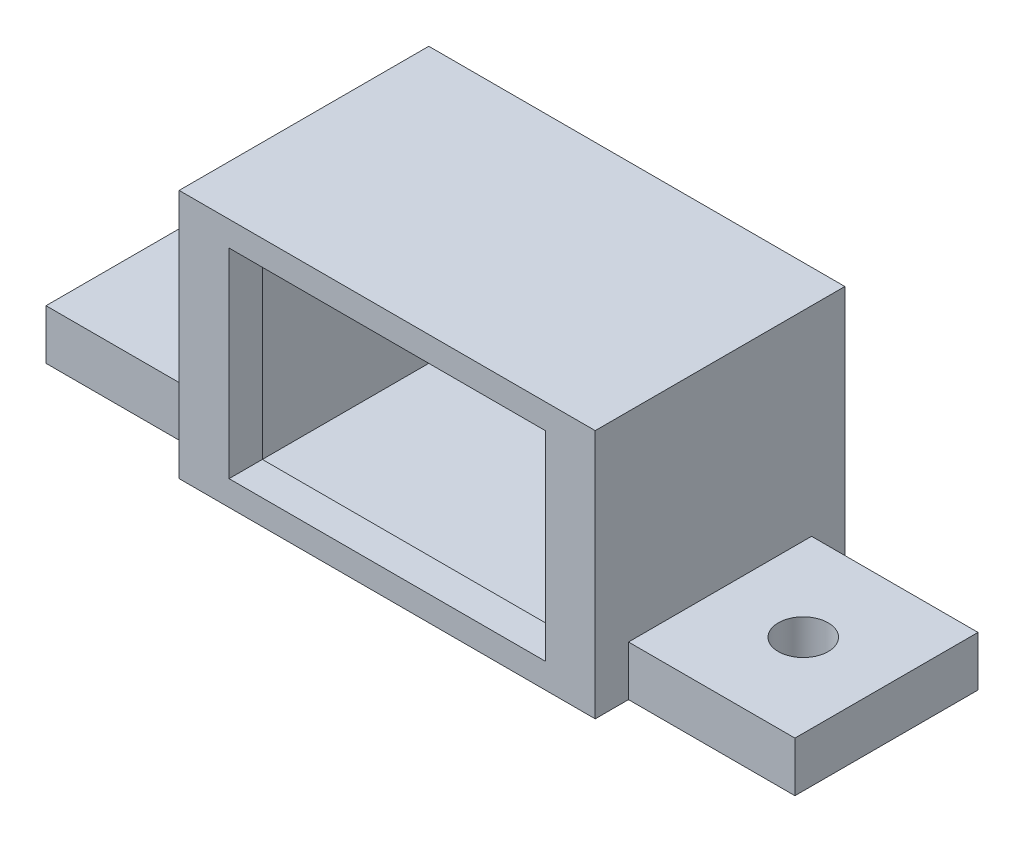
ISO-10303-21;
HEADER;
FILE_DESCRIPTION(('STEP AP214'),'2;1');
FILE_NAME('part.step','',(''),(''),'','','');
FILE_SCHEMA(('AUTOMOTIVE_DESIGN { 1 0 10303 214 1 1 1 1 }'));
ENDSEC;
DATA;
#1=APPLICATION_CONTEXT('core data for automotive mechanical design processes');
#2=APPLICATION_PROTOCOL_DEFINITION('international standard','automotive_design',2000,#1);
#3=PRODUCT_CONTEXT('',#1,'mechanical');
#4=PRODUCT('Part','Part','',(#3));
#5=PRODUCT_RELATED_PRODUCT_CATEGORY('part','',(#4));
#6=PRODUCT_DEFINITION_FORMATION('','',#4);
#7=PRODUCT_DEFINITION_CONTEXT('part definition',#1,'design');
#8=PRODUCT_DEFINITION('design','',#6,#7);
#9=PRODUCT_DEFINITION_SHAPE('','',#8);
#10=(LENGTH_UNIT() NAMED_UNIT(*) SI_UNIT(.MILLI.,.METRE.));
#11=(NAMED_UNIT(*) PLANE_ANGLE_UNIT() SI_UNIT($,.RADIAN.));
#12=(NAMED_UNIT(*) SI_UNIT($,.STERADIAN.) SOLID_ANGLE_UNIT());
#13=UNCERTAINTY_MEASURE_WITH_UNIT(LENGTH_MEASURE(1.E-05),#10,'distance_accuracy_value','');
#14=(GEOMETRIC_REPRESENTATION_CONTEXT(3) GLOBAL_UNCERTAINTY_ASSIGNED_CONTEXT((#13)) GLOBAL_UNIT_ASSIGNED_CONTEXT((#10,
#11,#12)) REPRESENTATION_CONTEXT('',''));
#15=CARTESIAN_POINT('',(0.,0.,0.));
#16=DIRECTION('',(0.,0.,1.));
#17=DIRECTION('',(1.,0.,0.));
#18=AXIS2_PLACEMENT_3D('',#15,#16,#17);
#19=CARTESIAN_POINT('',(25.,-15.,15.));
#20=DIRECTION('',(-1.,0.,0.));
#21=DIRECTION('',(0.,-1.,0.));
#22=AXIS2_PLACEMENT_3D('',#19,#20,#21);
#23=PLANE('',#22);
#24=DIRECTION('',(0.,-1.,0.));
#25=VECTOR('',#24,1.);
#26=CARTESIAN_POINT('',(25.,-15.,13.));
#27=LINE('',#26,#25);
#28=CARTESIAN_POINT('',(25.,-12.,13.));
#29=VERTEX_POINT('',#28);
#30=CARTESIAN_POINT('',(25.,-15.,13.));
#31=VERTEX_POINT('',#30);
#32=EDGE_CURVE('E61',#29,#31,#27,.T.);
#33=ORIENTED_EDGE('',*,*,#32,.F.);
#34=DIRECTION('',(0.,0.,1.));
#35=VECTOR('',#34,1.);
#36=CARTESIAN_POINT('',(25.,-12.,13.));
#37=LINE('',#36,#35);
#38=CARTESIAN_POINT('',(25.,-12.,2.));
#39=VERTEX_POINT('',#38);
#40=EDGE_CURVE('E665',#39,#29,#37,.T.);
#41=ORIENTED_EDGE('',*,*,#40,.F.);
#42=DIRECTION('',(0.,1.,0.));
#43=VECTOR('',#42,1.);
#44=CARTESIAN_POINT('',(25.,-15.,2.));
#45=LINE('',#44,#43);
#46=CARTESIAN_POINT('',(25.,-15.,2.));
#47=VERTEX_POINT('',#46);
#48=EDGE_CURVE('E67',#47,#39,#45,.T.);
#49=ORIENTED_EDGE('',*,*,#48,.F.);
#50=DIRECTION('',(0.,0.,-1.));
#51=VECTOR('',#50,1.);
#52=CARTESIAN_POINT('',(25.,-15.,15.));
#53=LINE('',#52,#51);
#54=CARTESIAN_POINT('',(25.,-15.,0.));
#55=VERTEX_POINT('',#54);
#56=EDGE_CURVE('E205',#47,#55,#53,.T.);
#57=ORIENTED_EDGE('',*,*,#56,.T.);
#58=DIRECTION('',(0.,1.,0.));
#59=VECTOR('',#58,1.);
#60=CARTESIAN_POINT('',(25.,-15.,0.));
#61=LINE('',#60,#59);
#62=CARTESIAN_POINT('',(25.,0.,0.));
#63=VERTEX_POINT('',#62);
#64=EDGE_CURVE('E340',#55,#63,#61,.T.);
#65=ORIENTED_EDGE('',*,*,#64,.T.);
#66=DIRECTION('',(0.,0.,-1.));
#67=VECTOR('',#66,1.);
#68=CARTESIAN_POINT('',(25.,0.,15.));
#69=LINE('',#68,#67);
#70=CARTESIAN_POINT('',(25.,0.,15.));
#71=VERTEX_POINT('',#70);
#72=EDGE_CURVE('E349',#71,#63,#69,.T.);
#73=ORIENTED_EDGE('',*,*,#72,.F.);
#74=DIRECTION('',(0.,1.,0.));
#75=VECTOR('',#74,1.);
#76=CARTESIAN_POINT('',(25.,-15.,15.));
#77=LINE('',#76,#75);
#78=CARTESIAN_POINT('',(25.,-15.,15.));
#79=VERTEX_POINT('',#78);
#80=EDGE_CURVE('E346',#79,#71,#77,.T.);
#81=ORIENTED_EDGE('',*,*,#80,.F.);
#82=EDGE_CURVE('E365',#79,#31,#53,.T.);
#83=ORIENTED_EDGE('',*,*,#82,.T.);
#84=EDGE_LOOP('',(#33,#41,#49,#57,#65,#73,#81,#83));
#85=FACE_BOUND('',#84,.T.);
#86=ADVANCED_FACE('F45',(#85),#23,.F.);
#87=CARTESIAN_POINT('',(0.,0.,15.));
#88=DIRECTION('',(1.,0.,0.));
#89=DIRECTION('',(0.,1.,0.));
#90=AXIS2_PLACEMENT_3D('',#87,#88,#89);
#91=PLANE('',#90);
#92=DIRECTION('',(0.,-1.,0.));
#93=VECTOR('',#92,1.);
#94=CARTESIAN_POINT('',(0.,-15.,2.));
#95=LINE('',#94,#93);
#96=CARTESIAN_POINT('',(0.,-12.,2.));
#97=VERTEX_POINT('',#96);
#98=CARTESIAN_POINT('',(0.,-15.,2.));
#99=VERTEX_POINT('',#98);
#100=EDGE_CURVE('E227',#97,#99,#95,.T.);
#101=ORIENTED_EDGE('',*,*,#100,.F.);
#102=DIRECTION('',(0.,0.,-1.));
#103=VECTOR('',#102,1.);
#104=CARTESIAN_POINT('',(0.,-12.,2.));
#105=LINE('',#104,#103);
#106=CARTESIAN_POINT('',(0.,-12.,13.));
#107=VERTEX_POINT('',#106);
#108=EDGE_CURVE('E240',#107,#97,#105,.T.);
#109=ORIENTED_EDGE('',*,*,#108,.F.);
#110=DIRECTION('',(0.,1.,0.));
#111=VECTOR('',#110,1.);
#112=CARTESIAN_POINT('',(0.,-15.,13.));
#113=LINE('',#112,#111);
#114=CARTESIAN_POINT('',(0.,-15.,13.));
#115=VERTEX_POINT('',#114);
#116=EDGE_CURVE('E220',#115,#107,#113,.T.);
#117=ORIENTED_EDGE('',*,*,#116,.F.);
#118=DIRECTION('',(0.,0.,-1.));
#119=VECTOR('',#118,1.);
#120=CARTESIAN_POINT('',(0.,-15.,15.));
#121=LINE('',#120,#119);
#122=CARTESIAN_POINT('',(0.,-15.,15.));
#123=VERTEX_POINT('',#122);
#124=EDGE_CURVE('E369',#123,#115,#121,.T.);
#125=ORIENTED_EDGE('',*,*,#124,.F.);
#126=DIRECTION('',(0.,-1.,0.));
#127=VECTOR('',#126,1.);
#128=CARTESIAN_POINT('',(0.,0.,15.));
#129=LINE('',#128,#127);
#130=CARTESIAN_POINT('',(0.,0.,15.));
#131=VERTEX_POINT('',#130);
#132=EDGE_CURVE('E339',#131,#123,#129,.T.);
#133=ORIENTED_EDGE('',*,*,#132,.F.);
#134=DIRECTION('',(0.,0.,-1.));
#135=VECTOR('',#134,1.);
#136=CARTESIAN_POINT('',(0.,0.,15.));
#137=LINE('',#136,#135);
#138=CARTESIAN_POINT('',(0.,0.,0.));
#139=VERTEX_POINT('',#138);
#140=EDGE_CURVE('E373',#131,#139,#137,.T.);
#141=ORIENTED_EDGE('',*,*,#140,.T.);
#142=DIRECTION('',(0.,-1.,0.));
#143=VECTOR('',#142,1.);
#144=CARTESIAN_POINT('',(0.,0.,0.));
#145=LINE('',#144,#143);
#146=CARTESIAN_POINT('',(0.,-15.,0.));
#147=VERTEX_POINT('',#146);
#148=EDGE_CURVE('E353',#139,#147,#145,.T.);
#149=ORIENTED_EDGE('',*,*,#148,.T.);
#150=EDGE_CURVE('E368',#99,#147,#121,.T.);
#151=ORIENTED_EDGE('',*,*,#150,.F.);
#152=EDGE_LOOP('',(#101,#109,#117,#125,#133,#141,#149,#151));
#153=FACE_BOUND('',#152,.T.);
#154=ADVANCED_FACE('F420',(#153),#91,.F.);
#155=CARTESIAN_POINT('',(25.,0.,15.));
#156=DIRECTION('',(0.,-1.,0.));
#157=DIRECTION('',(1.,0.,0.));
#158=AXIS2_PLACEMENT_3D('',#155,#156,#157);
#159=PLANE('',#158);
#160=DIRECTION('',(-1.,0.,0.));
#161=VECTOR('',#160,1.);
#162=CARTESIAN_POINT('',(25.,0.,0.));
#163=LINE('',#162,#161);
#164=EDGE_CURVE('E325',#63,#139,#163,.T.);
#165=ORIENTED_EDGE('',*,*,#164,.T.);
#166=ORIENTED_EDGE('',*,*,#140,.F.);
#167=DIRECTION('',(-1.,0.,0.));
#168=VECTOR('',#167,1.);
#169=CARTESIAN_POINT('',(25.,0.,15.));
#170=LINE('',#169,#168);
#171=EDGE_CURVE('E335',#71,#131,#170,.T.);
#172=ORIENTED_EDGE('',*,*,#171,.F.);
#173=ORIENTED_EDGE('',*,*,#72,.T.);
#174=EDGE_LOOP('',(#165,#166,#172,#173));
#175=FACE_BOUND('',#174,.T.);
#176=ADVANCED_FACE('F47',(#175),#159,.F.);
#177=CARTESIAN_POINT('',(0.,-15.,15.));
#178=DIRECTION('',(0.,1.,0.));
#179=DIRECTION('',(0.,0.,1.));
#180=AXIS2_PLACEMENT_3D('',#177,#178,#179);
#181=PLANE('',#180);
#182=CARTESIAN_POINT('',(30.,-15.,7.5));
#183=DIRECTION('',(0.,1.,0.));
#184=DIRECTION('',(-1.,0.,0.));
#185=AXIS2_PLACEMENT_3D('',#182,#183,#184);
#186=CIRCLE('',#185,1.5);
#187=CARTESIAN_POINT('',(28.5,-15.,7.5));
#188=VERTEX_POINT('',#187);
#189=EDGE_CURVE('E473',#188,#188,#186,.T.);
#190=ORIENTED_EDGE('',*,*,#189,.T.);
#191=EDGE_LOOP('',(#190));
#192=FACE_BOUND('',#191,.T.);
#193=CARTESIAN_POINT('',(-5.,-15.,7.5));
#194=DIRECTION('',(0.,1.,0.));
#195=DIRECTION('',(-1.,0.,0.));
#196=AXIS2_PLACEMENT_3D('',#193,#194,#195);
#197=CIRCLE('',#196,1.5);
#198=CARTESIAN_POINT('',(-6.5,-15.,7.5));
#199=VERTEX_POINT('',#198);
#200=EDGE_CURVE('E212',#199,#199,#197,.T.);
#201=ORIENTED_EDGE('',*,*,#200,.T.);
#202=EDGE_LOOP('',(#201));
#203=FACE_BOUND('',#202,.T.);
#204=DIRECTION('',(1.,0.,0.));
#205=VECTOR('',#204,1.);
#206=CARTESIAN_POINT('',(0.,-15.,0.));
#207=LINE('',#206,#205);
#208=EDGE_CURVE('E357',#147,#55,#207,.T.);
#209=ORIENTED_EDGE('',*,*,#208,.T.);
#210=ORIENTED_EDGE('',*,*,#56,.F.);
#211=DIRECTION('',(-1.,0.,0.));
#212=VECTOR('',#211,1.);
#213=CARTESIAN_POINT('',(35.,-15.,2.));
#214=LINE('',#213,#212);
#215=CARTESIAN_POINT('',(35.,-15.,2.));
#216=VERTEX_POINT('',#215);
#217=EDGE_CURVE('E185',#216,#47,#214,.T.);
#218=ORIENTED_EDGE('',*,*,#217,.F.);
#219=DIRECTION('',(0.,0.,-1.));
#220=VECTOR('',#219,1.);
#221=CARTESIAN_POINT('',(35.,-15.,13.));
#222=LINE('',#221,#220);
#223=CARTESIAN_POINT('',(35.,-15.,13.));
#224=VERTEX_POINT('',#223);
#225=EDGE_CURVE('E192',#224,#216,#222,.T.);
#226=ORIENTED_EDGE('',*,*,#225,.F.);
#227=DIRECTION('',(-1.,0.,0.));
#228=VECTOR('',#227,1.);
#229=CARTESIAN_POINT('',(35.,-15.,13.));
#230=LINE('',#229,#228);
#231=EDGE_CURVE('E425',#224,#31,#230,.T.);
#232=ORIENTED_EDGE('',*,*,#231,.T.);
#233=ORIENTED_EDGE('',*,*,#82,.F.);
#234=DIRECTION('',(1.,0.,0.));
#235=VECTOR('',#234,1.);
#236=CARTESIAN_POINT('',(0.,-15.,15.));
#237=LINE('',#236,#235);
#238=EDGE_CURVE('E343',#123,#79,#237,.T.);
#239=ORIENTED_EDGE('',*,*,#238,.F.);
#240=ORIENTED_EDGE('',*,*,#124,.T.);
#241=DIRECTION('',(1.,0.,0.));
#242=VECTOR('',#241,1.);
#243=CARTESIAN_POINT('',(-10.,-15.,13.));
#244=LINE('',#243,#242);
#245=CARTESIAN_POINT('',(-10.,-15.,13.));
#246=VERTEX_POINT('',#245);
#247=EDGE_CURVE('E258',#246,#115,#244,.T.);
#248=ORIENTED_EDGE('',*,*,#247,.F.);
#249=DIRECTION('',(0.,0.,1.));
#250=VECTOR('',#249,1.);
#251=CARTESIAN_POINT('',(-10.,-15.,2.));
#252=LINE('',#251,#250);
#253=CARTESIAN_POINT('',(-10.,-15.,2.));
#254=VERTEX_POINT('',#253);
#255=EDGE_CURVE('E222',#254,#246,#252,.T.);
#256=ORIENTED_EDGE('',*,*,#255,.F.);
#257=DIRECTION('',(1.,0.,0.));
#258=VECTOR('',#257,1.);
#259=CARTESIAN_POINT('',(-10.,-15.,2.));
#260=LINE('',#259,#258);
#261=EDGE_CURVE('E236',#254,#99,#260,.T.);
#262=ORIENTED_EDGE('',*,*,#261,.T.);
#263=ORIENTED_EDGE('',*,*,#150,.T.);
#264=EDGE_LOOP('',(#209,#210,#218,#226,#232,#233,#239,#240,#248,#256,#262,#263));
#265=FACE_BOUND('',#264,.T.);
#266=ADVANCED_FACE('F204',(#192,#203,#265),#181,.F.);
#267=CARTESIAN_POINT('',(0.,0.,15.));
#268=DIRECTION('',(0.,0.,1.));
#269=DIRECTION('',(1.,0.,0.));
#270=AXIS2_PLACEMENT_3D('',#267,#268,#269);
#271=PLANE('',#270);
#272=DIRECTION('',(1.,0.,0.));
#273=VECTOR('',#272,1.);
#274=CARTESIAN_POINT('',(3.,-13.5,15.));
#275=LINE('',#274,#273);
#276=CARTESIAN_POINT('',(3.,-13.5,15.));
#277=VERTEX_POINT('',#276);
#278=CARTESIAN_POINT('',(22.,-13.5,15.));
#279=VERTEX_POINT('',#278);
#280=EDGE_CURVE('E262',#277,#279,#275,.T.);
#281=ORIENTED_EDGE('',*,*,#280,.F.);
#282=DIRECTION('',(0.,-1.,0.));
#283=VECTOR('',#282,1.);
#284=CARTESIAN_POINT('',(3.,-13.5,15.));
#285=LINE('',#284,#283);
#286=CARTESIAN_POINT('',(3.,-1.5,15.));
#287=VERTEX_POINT('',#286);
#288=EDGE_CURVE('E273',#287,#277,#285,.T.);
#289=ORIENTED_EDGE('',*,*,#288,.F.);
#290=DIRECTION('',(-1.,0.,0.));
#291=VECTOR('',#290,1.);
#292=CARTESIAN_POINT('',(3.,-1.5,15.));
#293=LINE('',#292,#291);
#294=CARTESIAN_POINT('',(22.,-1.5,15.));
#295=VERTEX_POINT('',#294);
#296=EDGE_CURVE('E269',#295,#287,#293,.T.);
#297=ORIENTED_EDGE('',*,*,#296,.F.);
#298=DIRECTION('',(0.,1.,0.));
#299=VECTOR('',#298,1.);
#300=CARTESIAN_POINT('',(22.,-1.5,15.));
#301=LINE('',#300,#299);
#302=EDGE_CURVE('E265',#279,#295,#301,.T.);
#303=ORIENTED_EDGE('',*,*,#302,.F.);
#304=EDGE_LOOP('',(#281,#289,#297,#303));
#305=FACE_BOUND('',#304,.T.);
#306=ORIENTED_EDGE('',*,*,#171,.T.);
#307=ORIENTED_EDGE('',*,*,#132,.T.);
#308=ORIENTED_EDGE('',*,*,#238,.T.);
#309=ORIENTED_EDGE('',*,*,#80,.T.);
#310=EDGE_LOOP('',(#306,#307,#308,#309));
#311=FACE_BOUND('',#310,.T.);
#312=ADVANCED_FACE('F407',(#305,#311),#271,.T.);
#313=CARTESIAN_POINT('',(0.,0.,0.));
#314=DIRECTION('',(0.,0.,1.));
#315=DIRECTION('',(1.,0.,0.));
#316=AXIS2_PLACEMENT_3D('',#313,#314,#315);
#317=PLANE('',#316);
#318=DIRECTION('',(0.,1.,0.));
#319=VECTOR('',#318,1.);
#320=CARTESIAN_POINT('',(2.5,-0.999999999999998,0.));
#321=LINE('',#320,#319);
#322=CARTESIAN_POINT('',(2.5,-14.,0.));
#323=VERTEX_POINT('',#322);
#324=CARTESIAN_POINT('',(2.5,-0.999999999999998,0.));
#325=VERTEX_POINT('',#324);
#326=EDGE_CURVE('E311',#323,#325,#321,.T.);
#327=ORIENTED_EDGE('',*,*,#326,.F.);
#328=DIRECTION('',(-1.,0.,0.));
#329=VECTOR('',#328,1.);
#330=CARTESIAN_POINT('',(2.5,-14.,0.));
#331=LINE('',#330,#329);
#332=CARTESIAN_POINT('',(22.5,-14.,0.));
#333=VERTEX_POINT('',#332);
#334=EDGE_CURVE('E281',#333,#323,#331,.T.);
#335=ORIENTED_EDGE('',*,*,#334,.F.);
#336=DIRECTION('',(0.,-1.,0.));
#337=VECTOR('',#336,1.);
#338=CARTESIAN_POINT('',(22.5,-1.,0.));
#339=LINE('',#338,#337);
#340=CARTESIAN_POINT('',(22.5,-1.,0.));
#341=VERTEX_POINT('',#340);
#342=EDGE_CURVE('E296',#341,#333,#339,.T.);
#343=ORIENTED_EDGE('',*,*,#342,.F.);
#344=DIRECTION('',(1.,0.,0.));
#345=VECTOR('',#344,1.);
#346=CARTESIAN_POINT('',(2.5,-0.999999999999998,0.));
#347=LINE('',#346,#345);
#348=EDGE_CURVE('E315',#325,#341,#347,.T.);
#349=ORIENTED_EDGE('',*,*,#348,.F.);
#350=EDGE_LOOP('',(#327,#335,#343,#349));
#351=FACE_BOUND('',#350,.T.);
#352=ORIENTED_EDGE('',*,*,#164,.F.);
#353=ORIENTED_EDGE('',*,*,#64,.F.);
#354=ORIENTED_EDGE('',*,*,#208,.F.);
#355=ORIENTED_EDGE('',*,*,#148,.F.);
#356=EDGE_LOOP('',(#352,#353,#354,#355));
#357=FACE_BOUND('',#356,.T.);
#358=ADVANCED_FACE('F410',(#351,#357),#317,.F.);
#359=CARTESIAN_POINT('',(2.5,-14.,13.));
#360=DIRECTION('',(0.,-1.,0.));
#361=DIRECTION('',(1.,0.,0.));
#362=AXIS2_PLACEMENT_3D('',#359,#360,#361);
#363=PLANE('',#362);
#364=ORIENTED_EDGE('',*,*,#334,.T.);
#365=DIRECTION('',(0.,0.,-1.));
#366=VECTOR('',#365,1.);
#367=CARTESIAN_POINT('',(2.5,-14.,13.));
#368=LINE('',#367,#366);
#369=CARTESIAN_POINT('',(2.5,-14.,13.));
#370=VERTEX_POINT('',#369);
#371=EDGE_CURVE('E308',#370,#323,#368,.T.);
#372=ORIENTED_EDGE('',*,*,#371,.F.);
#373=DIRECTION('',(-1.,0.,0.));
#374=VECTOR('',#373,1.);
#375=CARTESIAN_POINT('',(2.5,-14.,13.));
#376=LINE('',#375,#374);
#377=CARTESIAN_POINT('',(22.5,-14.,13.));
#378=VERTEX_POINT('',#377);
#379=EDGE_CURVE('E291',#378,#370,#376,.T.);
#380=ORIENTED_EDGE('',*,*,#379,.F.);
#381=DIRECTION('',(0.,0.,-1.));
#382=VECTOR('',#381,1.);
#383=CARTESIAN_POINT('',(22.5,-14.,13.));
#384=LINE('',#383,#382);
#385=EDGE_CURVE('E322',#378,#333,#384,.T.);
#386=ORIENTED_EDGE('',*,*,#385,.T.);
#387=EDGE_LOOP('',(#364,#372,#380,#386));
#388=FACE_BOUND('',#387,.T.);
#389=ADVANCED_FACE('F499',(#388),#363,.F.);
#390=CARTESIAN_POINT('',(22.5,-1.,13.));
#391=DIRECTION('',(1.,0.,0.));
#392=DIRECTION('',(0.,1.,0.));
#393=AXIS2_PLACEMENT_3D('',#390,#391,#392);
#394=PLANE('',#393);
#395=ORIENTED_EDGE('',*,*,#342,.T.);
#396=ORIENTED_EDGE('',*,*,#385,.F.);
#397=DIRECTION('',(0.,-1.,0.));
#398=VECTOR('',#397,1.);
#399=CARTESIAN_POINT('',(22.5,-1.,13.));
#400=LINE('',#399,#398);
#401=CARTESIAN_POINT('',(22.5,-1.,13.));
#402=VERTEX_POINT('',#401);
#403=EDGE_CURVE('E304',#402,#378,#400,.T.);
#404=ORIENTED_EDGE('',*,*,#403,.F.);
#405=DIRECTION('',(0.,0.,-1.));
#406=VECTOR('',#405,1.);
#407=CARTESIAN_POINT('',(22.5,-1.,13.));
#408=LINE('',#407,#406);
#409=EDGE_CURVE('E326',#402,#341,#408,.T.);
#410=ORIENTED_EDGE('',*,*,#409,.T.);
#411=EDGE_LOOP('',(#395,#396,#404,#410));
#412=FACE_BOUND('',#411,.T.);
#413=ADVANCED_FACE('F495',(#412),#394,.F.);
#414=CARTESIAN_POINT('',(2.5,-0.999999999999998,13.));
#415=DIRECTION('',(0.,1.,0.));
#416=DIRECTION('',(-1.,0.,0.));
#417=AXIS2_PLACEMENT_3D('',#414,#415,#416);
#418=PLANE('',#417);
#419=ORIENTED_EDGE('',*,*,#348,.T.);
#420=ORIENTED_EDGE('',*,*,#409,.F.);
#421=DIRECTION('',(1.,0.,0.));
#422=VECTOR('',#421,1.);
#423=CARTESIAN_POINT('',(2.5,-0.999999999999998,13.));
#424=LINE('',#423,#422);
#425=CARTESIAN_POINT('',(2.5,-0.999999999999998,13.));
#426=VERTEX_POINT('',#425);
#427=EDGE_CURVE('E300',#426,#402,#424,.T.);
#428=ORIENTED_EDGE('',*,*,#427,.F.);
#429=DIRECTION('',(0.,0.,-1.));
#430=VECTOR('',#429,1.);
#431=CARTESIAN_POINT('',(2.5,-0.999999999999998,13.));
#432=LINE('',#431,#430);
#433=EDGE_CURVE('E329',#426,#325,#432,.T.);
#434=ORIENTED_EDGE('',*,*,#433,.T.);
#435=EDGE_LOOP('',(#419,#420,#428,#434));
#436=FACE_BOUND('',#435,.T.);
#437=ADVANCED_FACE('F498',(#436),#418,.F.);
#438=CARTESIAN_POINT('',(2.5,-0.999999999999998,13.));
#439=DIRECTION('',(-1.,0.,0.));
#440=DIRECTION('',(0.,0.,1.));
#441=AXIS2_PLACEMENT_3D('',#438,#439,#440);
#442=PLANE('',#441);
#443=ORIENTED_EDGE('',*,*,#326,.T.);
#444=ORIENTED_EDGE('',*,*,#433,.F.);
#445=DIRECTION('',(0.,1.,0.));
#446=VECTOR('',#445,1.);
#447=CARTESIAN_POINT('',(2.5,-0.999999999999998,13.));
#448=LINE('',#447,#446);
#449=EDGE_CURVE('E295',#370,#426,#448,.T.);
#450=ORIENTED_EDGE('',*,*,#449,.F.);
#451=ORIENTED_EDGE('',*,*,#371,.T.);
#452=EDGE_LOOP('',(#443,#444,#450,#451));
#453=FACE_BOUND('',#452,.T.);
#454=ADVANCED_FACE('F494',(#453),#442,.F.);
#455=CARTESIAN_POINT('',(0.,0.,13.));
#456=DIRECTION('',(0.,0.,-1.));
#457=DIRECTION('',(-1.,0.,0.));
#458=AXIS2_PLACEMENT_3D('',#455,#456,#457);
#459=PLANE('',#458);
#460=DIRECTION('',(-1.,0.,0.));
#461=VECTOR('',#460,1.);
#462=CARTESIAN_POINT('',(0.,-13.5,13.));
#463=LINE('',#462,#461);
#464=CARTESIAN_POINT('',(22.,-13.5,13.));
#465=VERTEX_POINT('',#464);
#466=CARTESIAN_POINT('',(3.,-13.5,13.));
#467=VERTEX_POINT('',#466);
#468=EDGE_CURVE('E11',#465,#467,#463,.T.);
#469=ORIENTED_EDGE('',*,*,#468,.F.);
#470=DIRECTION('',(0.,-1.,0.));
#471=VECTOR('',#470,1.);
#472=CARTESIAN_POINT('',(22.,0.,13.));
#473=LINE('',#472,#471);
#474=CARTESIAN_POINT('',(22.,-1.5,13.));
#475=VERTEX_POINT('',#474);
#476=EDGE_CURVE('E377',#475,#465,#473,.T.);
#477=ORIENTED_EDGE('',*,*,#476,.F.);
#478=DIRECTION('',(1.,0.,0.));
#479=VECTOR('',#478,1.);
#480=CARTESIAN_POINT('',(0.,-1.5,13.));
#481=LINE('',#480,#479);
#482=CARTESIAN_POINT('',(3.,-1.5,13.));
#483=VERTEX_POINT('',#482);
#484=EDGE_CURVE('E380',#483,#475,#481,.T.);
#485=ORIENTED_EDGE('',*,*,#484,.F.);
#486=DIRECTION('',(0.,1.,0.));
#487=VECTOR('',#486,1.);
#488=CARTESIAN_POINT('',(3.,0.,13.));
#489=LINE('',#488,#487);
#490=EDGE_CURVE('E54',#467,#483,#489,.T.);
#491=ORIENTED_EDGE('',*,*,#490,.F.);
#492=EDGE_LOOP('',(#469,#477,#485,#491));
#493=FACE_BOUND('',#492,.T.);
#494=ORIENTED_EDGE('',*,*,#379,.T.);
#495=ORIENTED_EDGE('',*,*,#449,.T.);
#496=ORIENTED_EDGE('',*,*,#427,.T.);
#497=ORIENTED_EDGE('',*,*,#403,.T.);
#498=EDGE_LOOP('',(#494,#495,#496,#497));
#499=FACE_BOUND('',#498,.T.);
#500=ADVANCED_FACE('F397',(#493,#499),#459,.T.);
#501=CARTESIAN_POINT('',(3.,-13.5,0.));
#502=DIRECTION('',(0.,-1.,0.));
#503=DIRECTION('',(1.,0.,0.));
#504=AXIS2_PLACEMENT_3D('',#501,#502,#503);
#505=PLANE('',#504);
#506=ORIENTED_EDGE('',*,*,#468,.T.);
#507=DIRECTION('',(0.,0.,1.));
#508=VECTOR('',#507,1.);
#509=CARTESIAN_POINT('',(3.,-13.5,0.));
#510=LINE('',#509,#508);
#511=EDGE_CURVE('E278',#467,#277,#510,.T.);
#512=ORIENTED_EDGE('',*,*,#511,.T.);
#513=ORIENTED_EDGE('',*,*,#280,.T.);
#514=DIRECTION('',(0.,0.,1.));
#515=VECTOR('',#514,1.);
#516=CARTESIAN_POINT('',(22.,-13.5,0.));
#517=LINE('',#516,#515);
#518=EDGE_CURVE('E277',#465,#279,#517,.T.);
#519=ORIENTED_EDGE('',*,*,#518,.F.);
#520=EDGE_LOOP('',(#506,#512,#513,#519));
#521=FACE_BOUND('',#520,.T.);
#522=ADVANCED_FACE('F404',(#521),#505,.F.);
#523=CARTESIAN_POINT('',(3.,-13.5,0.));
#524=DIRECTION('',(-1.,0.,0.));
#525=DIRECTION('',(0.,-1.,0.));
#526=AXIS2_PLACEMENT_3D('',#523,#524,#525);
#527=PLANE('',#526);
#528=ORIENTED_EDGE('',*,*,#490,.T.);
#529=DIRECTION('',(0.,0.,1.));
#530=VECTOR('',#529,1.);
#531=CARTESIAN_POINT('',(3.,-1.5,0.));
#532=LINE('',#531,#530);
#533=EDGE_CURVE('E282',#483,#287,#532,.T.);
#534=ORIENTED_EDGE('',*,*,#533,.T.);
#535=ORIENTED_EDGE('',*,*,#288,.T.);
#536=ORIENTED_EDGE('',*,*,#511,.F.);
#537=EDGE_LOOP('',(#528,#534,#535,#536));
#538=FACE_BOUND('',#537,.T.);
#539=ADVANCED_FACE('F388',(#538),#527,.F.);
#540=CARTESIAN_POINT('',(3.,-1.5,0.));
#541=DIRECTION('',(0.,1.,0.));
#542=DIRECTION('',(-1.,0.,0.));
#543=AXIS2_PLACEMENT_3D('',#540,#541,#542);
#544=PLANE('',#543);
#545=ORIENTED_EDGE('',*,*,#484,.T.);
#546=DIRECTION('',(0.,0.,1.));
#547=VECTOR('',#546,1.);
#548=CARTESIAN_POINT('',(22.,-1.5,0.));
#549=LINE('',#548,#547);
#550=EDGE_CURVE('E285',#475,#295,#549,.T.);
#551=ORIENTED_EDGE('',*,*,#550,.T.);
#552=ORIENTED_EDGE('',*,*,#296,.T.);
#553=ORIENTED_EDGE('',*,*,#533,.F.);
#554=EDGE_LOOP('',(#545,#551,#552,#553));
#555=FACE_BOUND('',#554,.T.);
#556=ADVANCED_FACE('F393',(#555),#544,.F.);
#557=CARTESIAN_POINT('',(22.,-1.5,0.));
#558=DIRECTION('',(1.,0.,0.));
#559=DIRECTION('',(0.,0.,-1.));
#560=AXIS2_PLACEMENT_3D('',#557,#558,#559);
#561=PLANE('',#560);
#562=ORIENTED_EDGE('',*,*,#476,.T.);
#563=ORIENTED_EDGE('',*,*,#518,.T.);
#564=ORIENTED_EDGE('',*,*,#302,.T.);
#565=ORIENTED_EDGE('',*,*,#550,.F.);
#566=EDGE_LOOP('',(#562,#563,#564,#565));
#567=FACE_BOUND('',#566,.T.);
#568=ADVANCED_FACE('F401',(#567),#561,.F.);
#569=CARTESIAN_POINT('',(-10.,-15.,13.));
#570=DIRECTION('',(0.,0.,-1.));
#571=DIRECTION('',(-1.,0.,0.));
#572=AXIS2_PLACEMENT_3D('',#569,#570,#571);
#573=PLANE('',#572);
#574=ORIENTED_EDGE('',*,*,#116,.T.);
#575=DIRECTION('',(1.,0.,0.));
#576=VECTOR('',#575,1.);
#577=CARTESIAN_POINT('',(-10.,-12.,13.));
#578=LINE('',#577,#576);
#579=CARTESIAN_POINT('',(-10.,-12.,13.));
#580=VERTEX_POINT('',#579);
#581=EDGE_CURVE('E254',#580,#107,#578,.T.);
#582=ORIENTED_EDGE('',*,*,#581,.F.);
#583=DIRECTION('',(0.,1.,0.));
#584=VECTOR('',#583,1.);
#585=CARTESIAN_POINT('',(-10.,-15.,13.));
#586=LINE('',#585,#584);
#587=EDGE_CURVE('E226',#246,#580,#586,.T.);
#588=ORIENTED_EDGE('',*,*,#587,.F.);
#589=ORIENTED_EDGE('',*,*,#247,.T.);
#590=EDGE_LOOP('',(#574,#582,#588,#589));
#591=FACE_BOUND('',#590,.T.);
#592=ADVANCED_FACE('F441',(#591),#573,.F.);
#593=CARTESIAN_POINT('',(-10.,-12.,2.));
#594=DIRECTION('',(0.,-1.,0.));
#595=DIRECTION('',(1.,0.,0.));
#596=AXIS2_PLACEMENT_3D('',#593,#594,#595);
#597=PLANE('',#596);
#598=CARTESIAN_POINT('',(-5.,-12.,7.5));
#599=DIRECTION('',(0.,1.,0.));
#600=DIRECTION('',(-1.,0.,0.));
#601=AXIS2_PLACEMENT_3D('',#598,#599,#600);
#602=CIRCLE('',#601,1.5);
#603=CARTESIAN_POINT('',(-6.5,-12.,7.5));
#604=VERTEX_POINT('',#603);
#605=EDGE_CURVE('E207',#604,#604,#602,.T.);
#606=ORIENTED_EDGE('',*,*,#605,.F.);
#607=EDGE_LOOP('',(#606));
#608=FACE_BOUND('',#607,.T.);
#609=ORIENTED_EDGE('',*,*,#108,.T.);
#610=DIRECTION('',(1.,0.,0.));
#611=VECTOR('',#610,1.);
#612=CARTESIAN_POINT('',(-10.,-12.,2.));
#613=LINE('',#612,#611);
#614=CARTESIAN_POINT('',(-10.,-12.,2.));
#615=VERTEX_POINT('',#614);
#616=EDGE_CURVE('E250',#615,#97,#613,.T.);
#617=ORIENTED_EDGE('',*,*,#616,.F.);
#618=DIRECTION('',(0.,0.,-1.));
#619=VECTOR('',#618,1.);
#620=CARTESIAN_POINT('',(-10.,-12.,2.));
#621=LINE('',#620,#619);
#622=EDGE_CURVE('E230',#580,#615,#621,.T.);
#623=ORIENTED_EDGE('',*,*,#622,.F.);
#624=ORIENTED_EDGE('',*,*,#581,.T.);
#625=EDGE_LOOP('',(#609,#617,#623,#624));
#626=FACE_BOUND('',#625,.T.);
#627=ADVANCED_FACE('F438',(#608,#626),#597,.F.);
#628=CARTESIAN_POINT('',(-10.,-15.,2.));
#629=DIRECTION('',(0.,0.,1.));
#630=DIRECTION('',(1.,0.,0.));
#631=AXIS2_PLACEMENT_3D('',#628,#629,#630);
#632=PLANE('',#631);
#633=ORIENTED_EDGE('',*,*,#100,.T.);
#634=ORIENTED_EDGE('',*,*,#261,.F.);
#635=DIRECTION('',(0.,-1.,0.));
#636=VECTOR('',#635,1.);
#637=CARTESIAN_POINT('',(-10.,-15.,2.));
#638=LINE('',#637,#636);
#639=EDGE_CURVE('E233',#615,#254,#638,.T.);
#640=ORIENTED_EDGE('',*,*,#639,.F.);
#641=ORIENTED_EDGE('',*,*,#616,.T.);
#642=EDGE_LOOP('',(#633,#634,#640,#641));
#643=FACE_BOUND('',#642,.T.);
#644=ADVANCED_FACE('F433',(#643),#632,.F.);
#645=CARTESIAN_POINT('',(-10.,0.,0.));
#646=DIRECTION('',(-1.,0.,0.));
#647=DIRECTION('',(0.,-1.,0.));
#648=AXIS2_PLACEMENT_3D('',#645,#646,#647);
#649=PLANE('',#648);
#650=ORIENTED_EDGE('',*,*,#255,.T.);
#651=ORIENTED_EDGE('',*,*,#587,.T.);
#652=ORIENTED_EDGE('',*,*,#622,.T.);
#653=ORIENTED_EDGE('',*,*,#639,.T.);
#654=EDGE_LOOP('',(#650,#651,#652,#653));
#655=FACE_BOUND('',#654,.T.);
#656=ADVANCED_FACE('F443',(#655),#649,.T.);
#657=CARTESIAN_POINT('',(-5.,-15.,7.5));
#658=DIRECTION('',(0.,1.,0.));
#659=DIRECTION('',(-1.,0.,0.));
#660=AXIS2_PLACEMENT_3D('',#657,#658,#659);
#661=CYLINDRICAL_SURFACE('',#660,1.5);
#662=CARTESIAN_POINT('',(-6.5,-15.,7.5));
#663=CARTESIAN_POINT('',(-6.5,-14.96875,7.5));
#664=CARTESIAN_POINT('',(-6.5,-14.9375,7.5));
#665=CARTESIAN_POINT('',(-6.5,-14.875,7.5));
#666=CARTESIAN_POINT('',(-6.5,-14.84375,7.5));
#667=CARTESIAN_POINT('',(-6.5,-14.78125,7.5));
#668=CARTESIAN_POINT('',(-6.5,-14.75,7.5));
#669=CARTESIAN_POINT('',(-6.5,-14.6875,7.5));
#670=CARTESIAN_POINT('',(-6.5,-14.65625,7.5));
#671=CARTESIAN_POINT('',(-6.5,-14.59375,7.5));
#672=CARTESIAN_POINT('',(-6.5,-14.5625,7.5));
#673=CARTESIAN_POINT('',(-6.5,-14.5,7.5));
#674=CARTESIAN_POINT('',(-6.5,-14.46875,7.5));
#675=CARTESIAN_POINT('',(-6.5,-14.40625,7.5));
#676=CARTESIAN_POINT('',(-6.5,-14.375,7.5));
#677=CARTESIAN_POINT('',(-6.5,-14.3125,7.5));
#678=CARTESIAN_POINT('',(-6.5,-14.28125,7.5));
#679=CARTESIAN_POINT('',(-6.5,-14.21875,7.5));
#680=CARTESIAN_POINT('',(-6.5,-14.1875,7.5));
#681=CARTESIAN_POINT('',(-6.5,-14.125,7.5));
#682=CARTESIAN_POINT('',(-6.5,-14.09375,7.5));
#683=CARTESIAN_POINT('',(-6.5,-14.03125,7.5));
#684=CARTESIAN_POINT('',(-6.5,-14.,7.5));
#685=CARTESIAN_POINT('',(-6.5,-13.9375,7.5));
#686=CARTESIAN_POINT('',(-6.5,-13.90625,7.5));
#687=CARTESIAN_POINT('',(-6.5,-13.84375,7.5));
#688=CARTESIAN_POINT('',(-6.5,-13.8125,7.5));
#689=CARTESIAN_POINT('',(-6.5,-13.75,7.5));
#690=CARTESIAN_POINT('',(-6.5,-13.71875,7.5));
#691=CARTESIAN_POINT('',(-6.5,-13.65625,7.5));
#692=CARTESIAN_POINT('',(-6.5,-13.625,7.5));
#693=CARTESIAN_POINT('',(-6.5,-13.5625,7.5));
#694=CARTESIAN_POINT('',(-6.5,-13.53125,7.5));
#695=CARTESIAN_POINT('',(-6.5,-13.46875,7.5));
#696=CARTESIAN_POINT('',(-6.5,-13.4375,7.5));
#697=CARTESIAN_POINT('',(-6.5,-13.375,7.5));
#698=CARTESIAN_POINT('',(-6.5,-13.34375,7.5));
#699=CARTESIAN_POINT('',(-6.5,-13.28125,7.5));
#700=CARTESIAN_POINT('',(-6.5,-13.25,7.5));
#701=CARTESIAN_POINT('',(-6.5,-13.1875,7.5));
#702=CARTESIAN_POINT('',(-6.5,-13.15625,7.5));
#703=CARTESIAN_POINT('',(-6.5,-13.09375,7.5));
#704=CARTESIAN_POINT('',(-6.5,-13.0625,7.5));
#705=CARTESIAN_POINT('',(-6.5,-13.,7.5));
#706=CARTESIAN_POINT('',(-6.5,-12.96875,7.5));
#707=CARTESIAN_POINT('',(-6.5,-12.90625,7.5));
#708=CARTESIAN_POINT('',(-6.5,-12.875,7.5));
#709=CARTESIAN_POINT('',(-6.5,-12.8125,7.5));
#710=CARTESIAN_POINT('',(-6.5,-12.78125,7.5));
#711=CARTESIAN_POINT('',(-6.5,-12.71875,7.5));
#712=CARTESIAN_POINT('',(-6.5,-12.6875,7.5));
#713=CARTESIAN_POINT('',(-6.5,-12.625,7.5));
#714=CARTESIAN_POINT('',(-6.5,-12.59375,7.5));
#715=CARTESIAN_POINT('',(-6.5,-12.53125,7.5));
#716=CARTESIAN_POINT('',(-6.5,-12.5,7.5));
#717=CARTESIAN_POINT('',(-6.5,-12.4375,7.5));
#718=CARTESIAN_POINT('',(-6.5,-12.40625,7.5));
#719=CARTESIAN_POINT('',(-6.5,-12.34375,7.5));
#720=CARTESIAN_POINT('',(-6.5,-12.3125,7.5));
#721=CARTESIAN_POINT('',(-6.5,-12.25,7.5));
#722=CARTESIAN_POINT('',(-6.5,-12.21875,7.5));
#723=CARTESIAN_POINT('',(-6.5,-12.15625,7.5));
#724=CARTESIAN_POINT('',(-6.5,-12.125,7.5));
#725=CARTESIAN_POINT('',(-6.5,-12.0625,7.5));
#726=CARTESIAN_POINT('',(-6.5,-12.03125,7.5));
#727=CARTESIAN_POINT('',(-6.5,-12.,7.5));
#728=B_SPLINE_CURVE_WITH_KNOTS('',3,(#662,#663,#664,#665,#666,#667,#668,#669,#670,#671,#672,
#673,#674,#675,#676,#677,#678,#679,#680,#681,#682,#683,#684,#685,#686,#687,#688,#689,#690,#691,
#692,#693,#694,#695,#696,#697,#698,#699,#700,#701,#702,#703,#704,#705,#706,#707,#708,#709,#710,
#711,#712,#713,#714,#715,#716,#717,#718,#719,#720,#721,#722,#723,#724,#725,#726,#727),
.UNSPECIFIED.,.F.,.F.,(4,2,2,2,2,2,2,2,2,2,2,2,2,2,2,2,2,2,2,2,2,2,2,2,2,2,2,2,2,2,2,2,4),(0.,
0.0937500000000018,0.187500000000002,0.281250000000002,0.375000000000002,0.468750000000002,
0.562500000000002,0.656250000000002,0.750000000000002,0.843750000000002,0.937500000000003,
1.03125,1.125,1.21875,1.3125,1.40625,1.5,1.59375,1.6875,1.78125000000001,1.87500000000001,
1.96875,2.06250000000001,2.15625000000001,2.25000000000001,2.34375000000001,2.43750000000001,
2.53125000000001,2.62500000000001,2.71875000000001,2.81250000000001,2.90625000000001,
3.00000000000001),.UNSPECIFIED.);
#729=EDGE_CURVE('BSEAM445',#199,#604,#728,.T.);
#730=ORIENTED_EDGE('',*,*,#200,.F.);
#731=ORIENTED_EDGE('',*,*,#605,.T.);
#732=ORIENTED_EDGE('',*,*,#729,.T.);
#733=ORIENTED_EDGE('',*,*,#729,.F.);
#734=EDGE_LOOP('',(#730,#732,#731,#733));
#735=FACE_BOUND('',#734,.T.);
#736=ADVANCED_FACE('F445',(#735),#661,.F.);
#737=CARTESIAN_POINT('',(35.,-15.,2.));
#738=DIRECTION('',(0.,0.,1.));
#739=DIRECTION('',(0.,-1.,0.));
#740=AXIS2_PLACEMENT_3D('',#737,#738,#739);
#741=PLANE('',#740);
#742=ORIENTED_EDGE('',*,*,#48,.T.);
#743=DIRECTION('',(-1.,0.,0.));
#744=VECTOR('',#743,1.);
#745=CARTESIAN_POINT('',(35.,-12.,2.));
#746=LINE('',#745,#744);
#747=CARTESIAN_POINT('',(35.,-12.,2.));
#748=VERTEX_POINT('',#747);
#749=EDGE_CURVE('E187',#748,#39,#746,.T.);
#750=ORIENTED_EDGE('',*,*,#749,.F.);
#751=DIRECTION('',(0.,1.,0.));
#752=VECTOR('',#751,1.);
#753=CARTESIAN_POINT('',(35.,-15.,2.));
#754=LINE('',#753,#752);
#755=EDGE_CURVE('E181',#216,#748,#754,.T.);
#756=ORIENTED_EDGE('',*,*,#755,.F.);
#757=ORIENTED_EDGE('',*,*,#217,.T.);
#758=EDGE_LOOP('',(#742,#750,#756,#757));
#759=FACE_BOUND('',#758,.T.);
#760=ADVANCED_FACE('F183',(#759),#741,.F.);
#761=CARTESIAN_POINT('',(35.,-12.,13.));
#762=DIRECTION('',(0.,-1.,0.));
#763=DIRECTION('',(1.,0.,0.));
#764=AXIS2_PLACEMENT_3D('',#761,#762,#763);
#765=PLANE('',#764);
#766=CARTESIAN_POINT('',(30.,-12.,7.5));
#767=DIRECTION('',(0.,1.,0.));
#768=DIRECTION('',(-1.,0.,0.));
#769=AXIS2_PLACEMENT_3D('',#766,#767,#768);
#770=CIRCLE('',#769,1.5);
#771=CARTESIAN_POINT('',(28.5,-12.,7.5));
#772=VERTEX_POINT('',#771);
#773=EDGE_CURVE('E653',#772,#772,#770,.T.);
#774=ORIENTED_EDGE('',*,*,#773,.F.);
#775=EDGE_LOOP('',(#774));
#776=FACE_BOUND('',#775,.T.);
#777=ORIENTED_EDGE('',*,*,#40,.T.);
#778=DIRECTION('',(-1.,0.,0.));
#779=VECTOR('',#778,1.);
#780=CARTESIAN_POINT('',(35.,-12.,13.));
#781=LINE('',#780,#779);
#782=CARTESIAN_POINT('',(35.,-12.,13.));
#783=VERTEX_POINT('',#782);
#784=EDGE_CURVE('E214',#783,#29,#781,.T.);
#785=ORIENTED_EDGE('',*,*,#784,.F.);
#786=DIRECTION('',(0.,0.,1.));
#787=VECTOR('',#786,1.);
#788=CARTESIAN_POINT('',(35.,-12.,13.));
#789=LINE('',#788,#787);
#790=EDGE_CURVE('E191',#748,#783,#789,.T.);
#791=ORIENTED_EDGE('',*,*,#790,.F.);
#792=ORIENTED_EDGE('',*,*,#749,.T.);
#793=EDGE_LOOP('',(#777,#785,#791,#792));
#794=FACE_BOUND('',#793,.T.);
#795=ADVANCED_FACE('F612',(#776,#794),#765,.F.);
#796=CARTESIAN_POINT('',(35.,-15.,13.));
#797=DIRECTION('',(0.,0.,-1.));
#798=DIRECTION('',(-1.,0.,0.));
#799=AXIS2_PLACEMENT_3D('',#796,#797,#798);
#800=PLANE('',#799);
#801=ORIENTED_EDGE('',*,*,#32,.T.);
#802=ORIENTED_EDGE('',*,*,#231,.F.);
#803=DIRECTION('',(0.,-1.,0.));
#804=VECTOR('',#803,1.);
#805=CARTESIAN_POINT('',(35.,-15.,13.));
#806=LINE('',#805,#804);
#807=EDGE_CURVE('E197',#783,#224,#806,.T.);
#808=ORIENTED_EDGE('',*,*,#807,.F.);
#809=ORIENTED_EDGE('',*,*,#784,.T.);
#810=EDGE_LOOP('',(#801,#802,#808,#809));
#811=FACE_BOUND('',#810,.T.);
#812=ADVANCED_FACE('F621',(#811),#800,.F.);
#813=CARTESIAN_POINT('',(35.,0.,0.));
#814=DIRECTION('',(1.,0.,0.));
#815=DIRECTION('',(0.,0.,-1.));
#816=AXIS2_PLACEMENT_3D('',#813,#814,#815);
#817=PLANE('',#816);
#818=ORIENTED_EDGE('',*,*,#225,.T.);
#819=ORIENTED_EDGE('',*,*,#755,.T.);
#820=ORIENTED_EDGE('',*,*,#790,.T.);
#821=ORIENTED_EDGE('',*,*,#807,.T.);
#822=EDGE_LOOP('',(#818,#819,#820,#821));
#823=FACE_BOUND('',#822,.T.);
#824=ADVANCED_FACE('F195',(#823),#817,.T.);
#825=CARTESIAN_POINT('',(30.,-15.,7.5));
#826=DIRECTION('',(0.,1.,0.));
#827=DIRECTION('',(-1.,0.,0.));
#828=AXIS2_PLACEMENT_3D('',#825,#826,#827);
#829=CYLINDRICAL_SURFACE('',#828,1.5);
#830=ORIENTED_EDGE('',*,*,#189,.F.);
#831=EDGE_LOOP('',(#830));
#832=FACE_BOUND('',#831,.T.);
#833=ORIENTED_EDGE('',*,*,#773,.T.);
#834=EDGE_LOOP('',(#833));
#835=FACE_BOUND('',#834,.T.);
#836=ADVANCED_FACE('F639',(#832,#835),#829,.F.);
#837=CLOSED_SHELL('',(#86,#154,#176,#266,#312,#358,#389,#413,#437,#454,#500,#522,#539,#556,#568,
#592,#627,#644,#656,#736,#760,#795,#812,#824,#836));
#838=MANIFOLD_SOLID_BREP('B2',#837);
#839=ADVANCED_BREP_SHAPE_REPRESENTATION('',(#18,#838),#14);
#840=SHAPE_DEFINITION_REPRESENTATION(#9,#839);
ENDSEC;
END-ISO-10303-21;
